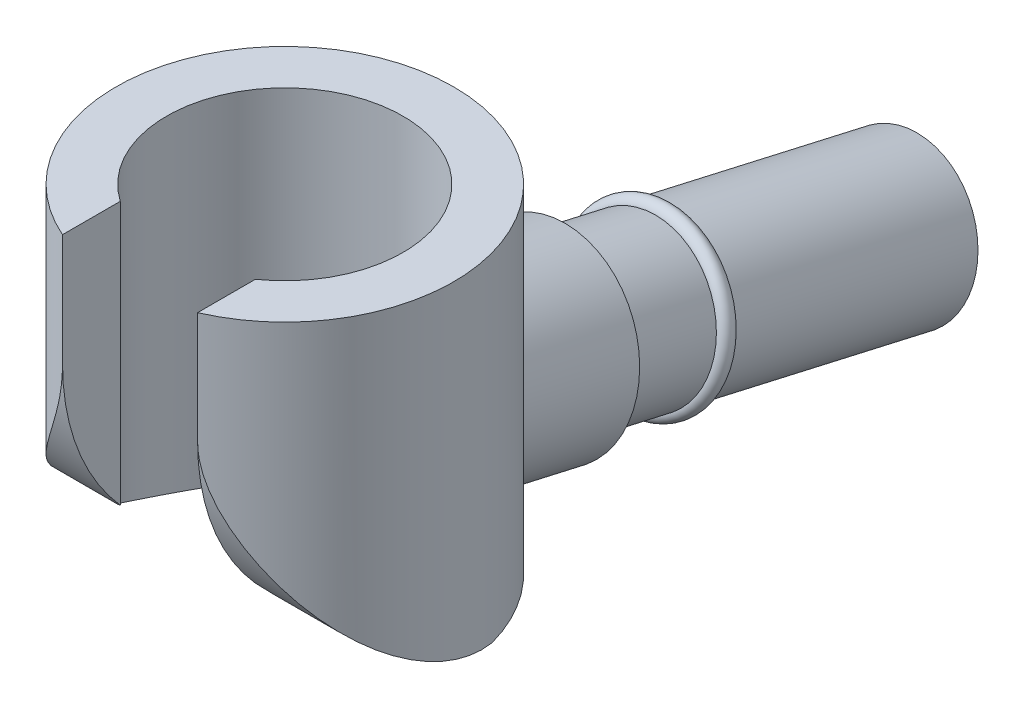
ISO-10303-21;
HEADER;
FILE_DESCRIPTION(('STEP AP214'),'2;1');
FILE_NAME('part.step','',(''),(''),'','','');
FILE_SCHEMA(('AUTOMOTIVE_DESIGN { 1 0 10303 214 1 1 1 1 }'));
ENDSEC;
DATA;
#1=APPLICATION_CONTEXT('core data for automotive mechanical design processes');
#2=APPLICATION_PROTOCOL_DEFINITION('international standard','automotive_design',2000,#1);
#3=PRODUCT_CONTEXT('',#1,'mechanical');
#4=PRODUCT('Part','Part','',(#3));
#5=PRODUCT_RELATED_PRODUCT_CATEGORY('part','',(#4));
#6=PRODUCT_DEFINITION_FORMATION('','',#4);
#7=PRODUCT_DEFINITION_CONTEXT('part definition',#1,'design');
#8=PRODUCT_DEFINITION('design','',#6,#7);
#9=PRODUCT_DEFINITION_SHAPE('','',#8);
#10=(LENGTH_UNIT() NAMED_UNIT(*) SI_UNIT(.MILLI.,.METRE.));
#11=(NAMED_UNIT(*) PLANE_ANGLE_UNIT() SI_UNIT($,.RADIAN.));
#12=(NAMED_UNIT(*) SI_UNIT($,.STERADIAN.) SOLID_ANGLE_UNIT());
#13=UNCERTAINTY_MEASURE_WITH_UNIT(LENGTH_MEASURE(1.E-05),#10,'distance_accuracy_value','');
#14=(GEOMETRIC_REPRESENTATION_CONTEXT(3) GLOBAL_UNCERTAINTY_ASSIGNED_CONTEXT((#13)) GLOBAL_UNIT_ASSIGNED_CONTEXT((#10,
#11,#12)) REPRESENTATION_CONTEXT('',''));
#15=CARTESIAN_POINT('',(0.,0.,0.));
#16=DIRECTION('',(0.,0.,1.));
#17=DIRECTION('',(1.,0.,0.));
#18=AXIS2_PLACEMENT_3D('',#15,#16,#17);
#19=CARTESIAN_POINT('',(0.,0.106688074089508,2.83802027552139));
#20=DIRECTION('',(0.,-0.2222292262514,-0.974994446650699));
#21=DIRECTION('',(0.,0.9749944466507,-0.2222292262514));
#22=AXIS2_PLACEMENT_3D('',#19,#20,#21);
#23=CYLINDRICAL_SURFACE('',#22,1.125);
#24=CARTESIAN_POINT('',(0.,-1.733868222328,-5.2371199660459));
#25=DIRECTION('',(0.,-0.2222292262514,-0.9749944466507));
#26=DIRECTION('',(0.,0.9749944466507,-0.2222292262514));
#27=AXIS2_PLACEMENT_3D('',#24,#25,#26);
#28=CIRCLE('',#27,1.125);
#29=CARTESIAN_POINT('',(0.,-0.63699946984596,-5.48712784557873));
#30=VERTEX_POINT('',#29);
#31=EDGE_CURVE('E11',#30,#30,#28,.T.);
#32=CARTESIAN_POINT('',(0.,-1.41657094977734,-3.84502998808623));
#33=DIRECTION('',(0.,-0.2222292262514,-0.9749944466507));
#34=DIRECTION('',(0.,0.9749944466507,-0.2222292262514));
#35=AXIS2_PLACEMENT_3D('',#32,#33,#34);
#36=CIRCLE('',#35,1.125);
#37=CARTESIAN_POINT('',(0.,-0.319702197295298,-4.09503786761905));
#38=VERTEX_POINT('',#37);
#39=EDGE_CURVE('E141',#38,#38,#36,.F.);
#40=CARTESIAN_POINT('',(0.,-0.63699946984596,-5.48712784557873));
#41=CARTESIAN_POINT('',(0.,-0.633694289923557,-5.47262690830832));
#42=CARTESIAN_POINT('',(0.,-0.630389110001154,-5.45812597103791));
#43=CARTESIAN_POINT('',(0.,-0.623778750156349,-5.42912409649708));
#44=CARTESIAN_POINT('',(0.,-0.620473570233946,-5.41462315922666));
#45=CARTESIAN_POINT('',(0.,-0.613863210389141,-5.38562128468584));
#46=CARTESIAN_POINT('',(0.,-0.610558030466738,-5.37112034741542));
#47=CARTESIAN_POINT('',(0.,-0.603947670621933,-5.3421184728746));
#48=CARTESIAN_POINT('',(0.,-0.60064249069953,-5.32761753560419));
#49=CARTESIAN_POINT('',(0.,-0.594032130854725,-5.29861566106336));
#50=CARTESIAN_POINT('',(0.,-0.590726950932322,-5.28411472379295));
#51=CARTESIAN_POINT('',(0.,-0.584116591087516,-5.25511284925212));
#52=CARTESIAN_POINT('',(0.,-0.580811411165114,-5.24061191198171));
#53=CARTESIAN_POINT('',(0.,-0.574201051320308,-5.21161003744088));
#54=CARTESIAN_POINT('',(0.,-0.570895871397905,-5.19710910017047));
#55=CARTESIAN_POINT('',(0.,-0.5642855115531,-5.16810722562964));
#56=CARTESIAN_POINT('',(0.,-0.560980331630697,-5.15360628835923));
#57=CARTESIAN_POINT('',(0.,-0.554369971785892,-5.1246044138184));
#58=CARTESIAN_POINT('',(0.,-0.551064791863489,-5.11010347654798));
#59=CARTESIAN_POINT('',(0.,-0.544454432018683,-5.08110160200716));
#60=CARTESIAN_POINT('',(0.,-0.541149252096281,-5.06660066473674));
#61=CARTESIAN_POINT('',(0.,-0.534538892251475,-5.03759879019592));
#62=CARTESIAN_POINT('',(0.,-0.531233712329073,-5.02309785292551));
#63=CARTESIAN_POINT('',(0.,-0.524623352484267,-4.99409597838468));
#64=CARTESIAN_POINT('',(0.,-0.521318172561864,-4.97959504111427));
#65=CARTESIAN_POINT('',(0.,-0.514707812717059,-4.95059316657344));
#66=CARTESIAN_POINT('',(0.,-0.511402632794656,-4.93609222930302));
#67=CARTESIAN_POINT('',(0.,-0.504792272949851,-4.9070903547622));
#68=CARTESIAN_POINT('',(0.,-0.501487093027448,-4.89258941749178));
#69=CARTESIAN_POINT('',(0.,-0.494876733182643,-4.86358754295096));
#70=CARTESIAN_POINT('',(0.,-0.49157155326024,-4.84908660568054));
#71=CARTESIAN_POINT('',(0.,-0.484961193415434,-4.82008473113972));
#72=CARTESIAN_POINT('',(0.,-0.481656013493032,-4.8055837938693));
#73=CARTESIAN_POINT('',(0.,-0.475045653648226,-4.77658191932848));
#74=CARTESIAN_POINT('',(0.,-0.471740473725823,-4.76208098205807));
#75=CARTESIAN_POINT('',(0.,-0.465130113881018,-4.73307910751724));
#76=CARTESIAN_POINT('',(0.,-0.461824933958615,-4.71857817024683));
#77=CARTESIAN_POINT('',(0.,-0.45521457411381,-4.689576295706));
#78=CARTESIAN_POINT('',(0.,-0.451909394191407,-4.67507535843558));
#79=CARTESIAN_POINT('',(0.,-0.445299034346602,-4.64607348389476));
#80=CARTESIAN_POINT('',(0.,-0.441993854424199,-4.63157254662435));
#81=CARTESIAN_POINT('',(0.,-0.435383494579394,-4.60257067208352));
#82=CARTESIAN_POINT('',(0.,-0.432078314656991,-4.58806973481311));
#83=CARTESIAN_POINT('',(0.,-0.425467954812185,-4.55906786027228));
#84=CARTESIAN_POINT('',(0.,-0.422162774889783,-4.54456692300186));
#85=CARTESIAN_POINT('',(0.,-0.415552415044977,-4.51556504846104));
#86=CARTESIAN_POINT('',(0.,-0.412247235122574,-4.50106411119063));
#87=CARTESIAN_POINT('',(0.,-0.405636875277769,-4.4720622366498));
#88=CARTESIAN_POINT('',(0.,-0.402331695355366,-4.45756129937939));
#89=CARTESIAN_POINT('',(0.,-0.395721335510561,-4.42855942483856));
#90=CARTESIAN_POINT('',(0.,-0.392416155588158,-4.41405848756814));
#91=CARTESIAN_POINT('',(0.,-0.385805795743353,-4.38505661302732));
#92=CARTESIAN_POINT('',(0.,-0.38250061582095,-4.37055567575691));
#93=CARTESIAN_POINT('',(0.,-0.375890255976144,-4.34155380121608));
#94=CARTESIAN_POINT('',(0.,-0.372585076053742,-4.32705286394567));
#95=CARTESIAN_POINT('',(0.,-0.365974716208936,-4.29805098940484));
#96=CARTESIAN_POINT('',(0.,-0.362669536286533,-4.28355005213442));
#97=CARTESIAN_POINT('',(0.,-0.356059176441728,-4.2545481775936));
#98=CARTESIAN_POINT('',(0.,-0.352753996519325,-4.24004724032319));
#99=CARTESIAN_POINT('',(0.,-0.34614363667452,-4.21104536578236));
#100=CARTESIAN_POINT('',(0.,-0.342838456752117,-4.19654442851195));
#101=CARTESIAN_POINT('',(0.,-0.336228096907312,-4.16754255397112));
#102=CARTESIAN_POINT('',(0.,-0.332922916984909,-4.1530416167007));
#103=CARTESIAN_POINT('',(0.,-0.326312557140104,-4.12403974215988));
#104=CARTESIAN_POINT('',(0.,-0.323007377217701,-4.10953880488946));
#105=CARTESIAN_POINT('',(0.,-0.319702197295298,-4.09503786761905));
#106=B_SPLINE_CURVE_WITH_KNOTS('',3,(#40,#41,#42,#43,#44,#45,#46,#47,#48,#49,#50,#51,#52,#53,
#54,#55,#56,#57,#58,#59,#60,#61,#62,#63,#64,#65,#66,#67,#68,#69,#70,#71,#72,#73,#74,#75,#76,#77,
#78,#79,#80,#81,#82,#83,#84,#85,#86,#87,#88,#89,#90,#91,#92,#93,#94,#95,#96,#97,#98,#99,#100,
#101,#102,#103,#104,#105),.UNSPECIFIED.,.F.,.F.,(4,2,2,2,2,2,2,2,2,2,2,2,2,2,2,2,2,2,2,2,2,2,2,
2,2,2,2,2,2,2,2,2,4),(0.,0.0446185226599817,0.0892370453199633,0.133855567979943,
0.178474090639925,0.223092613299905,0.267711135959887,0.312329658619867,0.356948181279848,
0.401566703939832,0.446185226599812,0.490803749259792,0.535422271919774,0.580040794579755,
0.624659317239737,0.669277839899717,0.713896362559698,0.758514885219678,0.80313340787966,
0.847751930539642,0.892370453199622,0.936988975859604,0.981607498519585,1.02622602117956,
1.07084454383955,1.11546306649953,1.16008158915951,1.20470011181949,1.24931863447947,
1.29393715713945,1.33855567979943,1.38317420245941,1.42779272511939),.UNSPECIFIED.);
#107=EDGE_CURVE('BSEAM39',#30,#38,#106,.T.);
#108=ORIENTED_EDGE('',*,*,#31,.F.);
#109=ORIENTED_EDGE('',*,*,#39,.F.);
#110=ORIENTED_EDGE('',*,*,#107,.T.);
#111=ORIENTED_EDGE('',*,*,#107,.F.);
#112=EDGE_LOOP('',(#108,#110,#109,#111));
#113=FACE_BOUND('',#112,.T.);
#114=ADVANCED_FACE('F39',(#113),#23,.T.);
#115=CARTESIAN_POINT('',(0.,2.5,0.));
#116=DIRECTION('',(0.,-1.,0.));
#117=DIRECTION('',(0.,0.,-1.));
#118=AXIS2_PLACEMENT_3D('',#115,#116,#117);
#119=CYLINDRICAL_SURFACE('',#118,2.5);
#120=CARTESIAN_POINT('',(0.,-2.5,0.));
#121=DIRECTION('',(0.,1.,0.));
#122=DIRECTION('',(0.,0.,1.));
#123=AXIS2_PLACEMENT_3D('',#120,#121,#122);
#124=CIRCLE('',#123,2.5);
#125=CARTESIAN_POINT('',(2.41130669969625,-2.5,-0.66));
#126=VERTEX_POINT('',#125);
#127=CARTESIAN_POINT('',(0.219384184354615,-2.5,-2.49035551270397));
#128=VERTEX_POINT('',#127);
#129=EDGE_CURVE('E108',#126,#128,#124,.T.);
#130=ORIENTED_EDGE('',*,*,#129,.T.);
#131=CARTESIAN_POINT('',(-0.219384184354619,-2.5,-2.49035551270397));
#132=CARTESIAN_POINT('',(-0.255186779967023,-2.49335082409158,-2.48720587012431));
#133=CARTESIAN_POINT('',(-0.290593340782335,-2.48509730880903,-2.48330394028805));
#134=CARTESIAN_POINT('',(-0.360341473433882,-2.46557857394026,-2.47414337462914));
#135=CARTESIAN_POINT('',(-0.394684286777849,-2.45431702518333,-2.46888639270506));
#136=CARTESIAN_POINT('',(-0.495251624868432,-2.41650517327502,-2.45139168234314));
#137=CARTESIAN_POINT('',(-0.559644725889556,-2.38580525646917,-2.43737033231907));
#138=CARTESIAN_POINT('',(-0.681796382824822,-2.31528005993979,-2.40606067272275));
#139=CARTESIAN_POINT('',(-0.739583764428192,-2.27549689203829,-2.38878750216002));
#140=CARTESIAN_POINT('',(-0.848467261338633,-2.18820110245933,-2.35231932653994));
#141=CARTESIAN_POINT('',(-0.899548415823743,-2.14067171166859,-2.33312018758849));
#142=CARTESIAN_POINT('',(-1.0018655679547,-2.03142565402125,-2.29123776749753));
#143=CARTESIAN_POINT('',(-1.05193606687366,-1.96865080639628,-2.26846983248171));
#144=CARTESIAN_POINT('',(-1.14231367060557,-1.83589673530843,-2.22433197663305));
#145=CARTESIAN_POINT('',(-1.18260906117861,-1.76590900976155,-2.20296375533724));
#146=CARTESIAN_POINT('',(-1.25763113103794,-1.60967489732566,-2.16112363599803));
#147=CARTESIAN_POINT('',(-1.29080024084887,-1.52252174278132,-2.1411912093188));
#148=CARTESIAN_POINT('',(-1.34169056980941,-1.34242329934212,-2.10969010799472));
#149=CARTESIAN_POINT('',(-1.35945312685521,-1.24949423140366,-2.0980990666072));
#150=CARTESIAN_POINT('',(-1.37468077974765,-1.08878704344612,-2.08813223944079));
#151=CARTESIAN_POINT('',(-1.37656182934873,-1.02159893815454,-2.08688355811567));
#152=CARTESIAN_POINT('',(-1.37081683820408,-0.887818342050301,-2.0906648193489));
#153=CARTESIAN_POINT('',(-1.36319901149814,-0.821225386715896,-2.09568933723798));
#154=CARTESIAN_POINT('',(-1.33827128545406,-0.690570301174489,-2.11169206036338));
#155=CARTESIAN_POINT('',(-1.32095355466029,-0.62651026077709,-2.12267507611381));
#156=CARTESIAN_POINT('',(-1.27700145725164,-0.50271105292956,-2.14940050226911));
#157=CARTESIAN_POINT('',(-1.25036087291475,-0.442974801326035,-2.16514608803758));
#158=CARTESIAN_POINT('',(-1.18838052366894,-0.328837013507613,-2.19977548904115));
#159=CARTESIAN_POINT('',(-1.15299931903326,-0.274462668490319,-2.21867411022504));
#160=CARTESIAN_POINT('',(-1.07449715410684,-0.17214906551925,-2.25773733912602));
#161=CARTESIAN_POINT('',(-1.03137362881243,-0.124211949424583,-2.27790236495462));
#162=CARTESIAN_POINT('',(-0.932885520441992,-0.0301609932756652,-2.32011014052549));
#163=CARTESIAN_POINT('',(-0.876681951949325,0.0151003685279647,-2.34210024384101));
#164=CARTESIAN_POINT('',(-0.75702779891279,0.096308593153384,-2.38346770627311));
#165=CARTESIAN_POINT('',(-0.693574884105899,0.132252448707723,-2.40284422087659));
#166=CARTESIAN_POINT('',(-0.557611797058086,0.195698288283308,-2.43807949489064));
#167=CARTESIAN_POINT('',(-0.484810532133151,0.222701842156806,-2.45372005063469));
#168=CARTESIAN_POINT('',(-0.334858345337995,0.265042531319288,-2.47863668177924));
#169=CARTESIAN_POINT('',(-0.257708852471134,0.28038347567527,-2.48791483507533));
#170=CARTESIAN_POINT('',(-0.104689543186053,0.298546233658708,-2.49893565426909));
#171=CARTESIAN_POINT('',(-0.0288996022025996,0.301861414455222,-2.50097521049408));
#172=CARTESIAN_POINT('',(0.12219903194427,0.297242149113583,-2.49815423542061));
#173=CARTESIAN_POINT('',(0.19750779079063,0.28930927281489,-2.49329466700102));
#174=CARTESIAN_POINT('',(0.34331262321269,0.262825450921442,-2.47737101996201));
#175=CARTESIAN_POINT('',(0.413884542247856,0.244580563196393,-2.4664859602746));
#176=CARTESIAN_POINT('',(0.550649970771421,0.198174280383473,-2.43959936047269));
#177=CARTESIAN_POINT('',(0.616842798565698,0.170011345645602,-2.42359702600218));
#178=CARTESIAN_POINT('',(0.745502416206489,0.10320629108337,-2.38722626497336));
#179=CARTESIAN_POINT('',(0.807760770529722,0.0642350285872427,-2.3667258226328));
#180=CARTESIAN_POINT('',(0.924538479065501,-0.0230749586336776,-2.32359818714786));
#181=CARTESIAN_POINT('',(0.979053330345681,-0.0714190954623333,-2.30096976916972));
#182=CARTESIAN_POINT('',(1.08095506098864,-0.178860852036004,-2.25494616362363));
#183=CARTESIAN_POINT('',(1.12798239179036,-0.238303490891133,-2.23155537087311));
#184=CARTESIAN_POINT('',(1.21073953079727,-0.365560956016161,-2.18776355321668));
#185=CARTESIAN_POINT('',(1.24647940207987,-0.433368249529057,-2.16735987397478));
#186=CARTESIAN_POINT('',(1.30341865003856,-0.57105393374215,-2.13357298195076));
#187=CARTESIAN_POINT('',(1.32541342012666,-0.640509826830616,-2.119819087244));
#188=CARTESIAN_POINT('',(1.35766439855938,-0.783056618390243,-2.09931511312568));
#189=CARTESIAN_POINT('',(1.36792978987959,-0.856144626416932,-2.09255955507695));
#190=CARTESIAN_POINT('',(1.37639728814623,-0.995620536483015,-2.08699437244454));
#191=CARTESIAN_POINT('',(1.3757409210038,-1.06191646057549,-2.08743277312391));
#192=CARTESIAN_POINT('',(1.36572438160862,-1.193550716348,-2.09399856039796));
#193=CARTESIAN_POINT('',(1.35636014013997,-1.25888858582549,-2.10012860671374));
#194=CARTESIAN_POINT('',(1.32881163976986,-1.39165885530708,-2.11767333009885));
#195=CARTESIAN_POINT('',(1.31006736584632,-1.45892834621216,-2.1294211128065));
#196=CARTESIAN_POINT('',(1.26444796618016,-1.58980529722393,-2.15682092448084));
#197=CARTESIAN_POINT('',(1.2375675980313,-1.65341036465052,-2.17247546958384));
#198=CARTESIAN_POINT('',(1.1698939780881,-1.78909245800422,-2.2097822172468));
#199=CARTESIAN_POINT('',(1.12736542374706,-1.8601503839319,-2.23200377484648));
#200=CARTESIAN_POINT('',(1.03198146752889,-1.99462145531971,-2.27767703483122));
#201=CARTESIAN_POINT('',(0.979117259982512,-2.05802800701542,-2.30112977359472));
#202=CARTESIAN_POINT('',(0.867547879087804,-2.1713915143626,-2.34535783359966));
#203=CARTESIAN_POINT('',(0.809518109714631,-2.22198181402977,-2.36620530563946));
#204=CARTESIAN_POINT('',(0.685457666371332,-2.31322961917076,-2.40506785185585));
#205=CARTESIAN_POINT('',(0.619454177200612,-2.35391952348893,-2.42309209407596));
#206=CARTESIAN_POINT('',(0.498315367584082,-2.41435184271782,-2.45040135077659));
#207=CARTESIAN_POINT('',(0.444765490431419,-2.43679023430068,-2.4607414172907));
#208=CARTESIAN_POINT('',(0.334319998814359,-2.47426257352081,-2.478188261799));
#209=CARTESIAN_POINT('',(0.277407752101724,-2.48925553218171,-2.4852771251203));
#210=CARTESIAN_POINT('',(0.219384184354619,-2.5,-2.49035551270397));
#211=B_SPLINE_CURVE_WITH_KNOTS('',3,(#131,#132,#133,#134,#135,#136,#137,#138,#139,#140,#141,
#142,#143,#144,#145,#146,#147,#148,#149,#150,#151,#152,#153,#154,#155,#156,#157,#158,#159,#160,
#161,#162,#163,#164,#165,#166,#167,#168,#169,#170,#171,#172,#173,#174,#175,#176,#177,#178,#179,
#180,#181,#182,#183,#184,#185,#186,#187,#188,#189,#190,#191,#192,#193,#194,#195,#196,#197,#198,
#199,#200,#201,#202,#203,#204,#205,#206,#207,#208,#209,#210),.UNSPECIFIED.,.F.,.F.,(4,2,2,2,2,2,
2,2,2,2,2,2,2,2,2,2,2,2,2,2,2,2,2,2,2,2,2,2,2,2,2,2,2,2,2,2,2,2,2,4),(0.,0.109553740909273,
0.218974394819068,0.43591274284376,0.651865039673394,0.868291198539255,1.11773856533307,
1.36748340289171,1.65201675190361,1.93578427602946,2.1365886288204,2.33721945880444,
2.53801250699046,2.73893972677989,2.94083847660591,3.14280423862265,3.36813455393789,
3.5935375053392,3.82995650241975,4.06629825065297,4.29282668439989,4.51932350572969,
4.73942657143294,4.9595638203957,5.18732500364367,5.41521809501664,5.65197177800612,
5.88851378888475,6.10965037943904,6.33061372242751,6.52864194169932,6.72676274668293,
6.93844912793856,7.15027219849173,7.40649937500913,7.66294580827424,7.90129603782285,
8.13885545140849,8.31516579401583,8.49243629684628),.UNSPECIFIED.);
#212=CARTESIAN_POINT('',(-0.219384184354619,-2.5,-2.49035551270397));
#213=VERTEX_POINT('',#212);
#214=EDGE_CURVE('E54',#213,#128,#211,.T.);
#215=ORIENTED_EDGE('',*,*,#214,.F.);
#216=CARTESIAN_POINT('',(-2.41130669969625,-2.5,-0.659999999999999));
#217=VERTEX_POINT('',#216);
#218=EDGE_CURVE('E105',#213,#217,#124,.T.);
#219=ORIENTED_EDGE('',*,*,#218,.T.);
#220=CARTESIAN_POINT('',(-1.,0.850000000000001,2.29128784747792));
#221=CARTESIAN_POINT('',(-0.999937958422172,0.801579105627371,2.29129949679798));
#222=CARTESIAN_POINT('',(-1.00238564768928,0.753204064898996,2.29024701082834));
#223=CARTESIAN_POINT('',(-1.01179284561074,0.657139607972769,2.28611452157189));
#224=CARTESIAN_POINT('',(-1.0187371175404,0.609448430285604,2.28304136481144));
#225=CARTESIAN_POINT('',(-1.03647734558849,0.515850884944401,2.27503868955448));
#226=CARTESIAN_POINT('',(-1.04720279831901,0.469927863783527,2.27014306483114));
#227=CARTESIAN_POINT('',(-1.0718461604706,0.379140610572085,2.25861300207627));
#228=CARTESIAN_POINT('',(-1.08576709279168,0.334277425724883,2.25197691672895));
#229=CARTESIAN_POINT('',(-1.12619540778974,0.216333554157594,2.23214417074754));
#230=CARTESIAN_POINT('',(-1.1549293231031,0.144260195624347,2.21751451297561));
#231=CARTESIAN_POINT('',(-1.21683589721039,0.00304787535303509,2.18415900336597));
#232=CARTESIAN_POINT('',(-1.25001157779933,-0.0660890461320796,2.16543035737496));
#233=CARTESIAN_POINT('',(-1.3194336646557,-0.202589313934496,2.12385296017166));
#234=CARTESIAN_POINT('',(-1.35571112160872,-0.269922938489367,2.10095910495329));
#235=CARTESIAN_POINT('',(-1.4297497148386,-0.402312444698018,2.05129425258822));
#236=CARTESIAN_POINT('',(-1.46751129349936,-0.467367636104561,2.0245220929189));
#237=CARTESIAN_POINT('',(-1.56188743066732,-0.62618987874318,1.9533241159604));
#238=CARTESIAN_POINT('',(-1.61884498497211,-0.718737948005976,1.90659570226283));
#239=CARTESIAN_POINT('',(-1.73183983801144,-0.899569072955493,1.80459160651131));
#240=CARTESIAN_POINT('',(-1.78787669643432,-0.987850125054751,1.74931195940726));
#241=CARTESIAN_POINT('',(-1.95150142488342,-1.24527646447137,1.57083919190796));
#242=CARTESIAN_POINT('',(-2.05536520365707,-1.40820946738173,1.43447805536141));
#243=CARTESIAN_POINT('',(-2.20708105709798,-1.65801777077192,1.18000280028187));
#244=CARTESIAN_POINT('',(-2.26178046913896,-1.75147813406713,1.07235980739644));
#245=CARTESIAN_POINT('',(-2.35722070775176,-1.92644409550327,0.842014301287578));
#246=CARTESIAN_POINT('',(-2.39797357764628,-2.00795997315565,0.719324906168244));
#247=CARTESIAN_POINT('',(-2.45551883326305,-2.14338051938298,0.482385793319588));
#248=CARTESIAN_POINT('',(-2.47518641613746,-2.19962316791889,0.370181138362285));
#249=CARTESIAN_POINT('',(-2.49883495345913,-2.29961722947135,0.138848919028895));
#250=CARTESIAN_POINT('',(-2.5028441007665,-2.34339096073747,0.0197341891228062));
#251=CARTESIAN_POINT('',(-2.4942204544191,-2.40835738351625,-0.193395907923674));
#252=CARTESIAN_POINT('',(-2.48529897969413,-2.43244209462352,-0.286685469230009));
#253=CARTESIAN_POINT('',(-2.46375604918711,-2.46238432268127,-0.426795877749868));
#254=CARTESIAN_POINT('',(-2.45519155977459,-2.47134504667182,-0.473615262989384));
#255=CARTESIAN_POINT('',(-2.4353142768711,-2.4872094855879,-0.567034853020757));
#256=CARTESIAN_POINT('',(-2.42400058715895,-2.49411252808548,-0.613634981276185));
#257=CARTESIAN_POINT('',(-2.41130669969625,-2.5,-0.659999999999999));
#258=B_SPLINE_CURVE_WITH_KNOTS('',3,(#220,#221,#222,#223,#224,#225,#226,#227,#228,#229,#230,
#231,#232,#233,#234,#235,#236,#237,#238,#239,#240,#241,#242,#243,#244,#245,#246,#247,#248,#249,
#250,#251,#252,#253,#254,#255,#256,#257),.UNSPECIFIED.,.F.,.F.,(4,2,2,2,2,2,2,2,2,2,2,2,2,2,2,2,
2,2,4),(0.,0.145116292225023,0.289743411308483,0.431805230146365,0.574001996330817,
0.810452780245971,1.04706525015712,1.28641157194819,1.52582978687737,1.88025354206948,
2.23484213240563,2.93950310543953,3.39613804670064,3.85237766693996,4.23196703975236,
4.61087264968618,4.90017375043309,5.04536120114352,5.1905960456507),.UNSPECIFIED.);
#259=CARTESIAN_POINT('',(-1.,0.85,2.29128784747792));
#260=VERTEX_POINT('',#259);
#261=EDGE_CURVE('E115',#260,#217,#258,.T.);
#262=ORIENTED_EDGE('',*,*,#261,.F.);
#263=DIRECTION('',(0.,-1.,0.));
#264=VECTOR('',#263,1.);
#265=CARTESIAN_POINT('',(-1.,2.5,2.29128784747792));
#266=LINE('',#265,#264);
#267=CARTESIAN_POINT('',(-1.,2.5,2.29128784747792));
#268=VERTEX_POINT('',#267);
#269=EDGE_CURVE('E136',#268,#260,#266,.T.);
#270=ORIENTED_EDGE('',*,*,#269,.F.);
#271=CARTESIAN_POINT('',(0.,2.5,0.));
#272=DIRECTION('',(0.,1.,0.));
#273=DIRECTION('',(0.,0.,1.));
#274=AXIS2_PLACEMENT_3D('',#271,#272,#273);
#275=CIRCLE('',#274,2.5);
#276=CARTESIAN_POINT('',(1.,2.5,2.29128784747792));
#277=VERTEX_POINT('',#276);
#278=EDGE_CURVE('E126',#277,#268,#275,.T.);
#279=ORIENTED_EDGE('',*,*,#278,.F.);
#280=DIRECTION('',(0.,-1.,0.));
#281=VECTOR('',#280,1.);
#282=CARTESIAN_POINT('',(1.,2.5,2.29128784747792));
#283=LINE('',#282,#281);
#284=CARTESIAN_POINT('',(1.,0.85,2.29128784747792));
#285=VERTEX_POINT('',#284);
#286=EDGE_CURVE('E127',#277,#285,#283,.T.);
#287=ORIENTED_EDGE('',*,*,#286,.T.);
#288=CARTESIAN_POINT('',(2.41130669969625,-2.5,-0.659999999999999));
#289=CARTESIAN_POINT('',(2.42745970540553,-2.4925224177079,-0.601036339123867));
#290=CARTESIAN_POINT('',(2.441368866193,-2.48338447408475,-0.541675374482108));
#291=CARTESIAN_POINT('',(2.4647442585609,-2.46177127766212,-0.422717712996618));
#292=CARTESIAN_POINT('',(2.47421269977685,-2.4492976894914,-0.363121148302988));
#293=CARTESIAN_POINT('',(2.48871547141529,-2.42109021814085,-0.24461571848185));
#294=CARTESIAN_POINT('',(2.49378096224948,-2.40538023621529,-0.185704980764622));
#295=CARTESIAN_POINT('',(2.49974565320429,-2.37073141100746,-0.0686411257621628));
#296=CARTESIAN_POINT('',(2.50064457780181,-2.35179235428157,-0.0104880588330834));
#297=CARTESIAN_POINT('',(2.4973853883414,-2.29037250667678,0.161974020371972));
#298=CARTESIAN_POINT('',(2.48730520786167,-2.24321856387991,0.274582117887437));
#299=CARTESIAN_POINT('',(2.45351283028644,-2.13798533546282,0.49243634090751));
#300=CARTESIAN_POINT('',(2.42977663503142,-2.07988693799692,0.597669139393228));
#301=CARTESIAN_POINT('',(2.36015876536052,-1.93100322917406,0.836923223331761));
#302=CARTESIAN_POINT('',(2.30931151928592,-1.83612771098483,0.966954278962182));
#303=CARTESIAN_POINT('',(2.1925982247573,-1.6330210358564,1.20854770454745));
#304=CARTESIAN_POINT('',(2.12670454301742,-1.52476547594452,1.32007543361938));
#305=CARTESIAN_POINT('',(2.00751116187544,-1.3336865797561,1.49236169156739));
#306=CARTESIAN_POINT('',(1.95678552582207,-1.25359799143753,1.55804424624378));
#307=CARTESIAN_POINT('',(1.85224814406491,-1.08907760157743,1.68097759746323));
#308=CARTESIAN_POINT('',(1.79843625291599,-1.00464559536416,1.73822799617193));
#309=CARTESIAN_POINT('',(1.68911878946203,-0.831501962726443,1.8446423383809));
#310=CARTESIAN_POINT('',(1.63360917951518,-0.742779785919259,1.89378488289768));
#311=CARTESIAN_POINT('',(1.52284966317443,-0.561233016886666,1.98394223155908));
#312=CARTESIAN_POINT('',(1.46759963614271,-0.468410594416377,2.02496127292324));
#313=CARTESIAN_POINT('',(1.35522805445461,-0.270241495095874,2.1019827326037));
#314=CARTESIAN_POINT('',(1.29832634656818,-0.164492651627803,2.13729502094468));
#315=CARTESIAN_POINT('',(1.21930278425905,-0.00126908531485326,2.18271141167134));
#316=CARTESIAN_POINT('',(1.19410608680725,0.0536732273566707,2.19655043444126));
#317=CARTESIAN_POINT('',(1.14670535341879,0.1653952183894,2.22166207762166));
#318=CARTESIAN_POINT('',(1.12450114247075,0.222174789060095,2.2329348481424));
#319=CARTESIAN_POINT('',(1.07309749605041,0.370029276358621,2.25824733811499));
#320=CARTESIAN_POINT('',(1.04688856340569,0.462594145854952,2.27033198138852));
#321=CARTESIAN_POINT('',(1.01941674037457,0.60508367244109,2.28273981741603));
#322=CARTESIAN_POINT('',(1.01222390992232,0.65362351182498,2.28592449222381));
#323=CARTESIAN_POINT('',(1.00247620164124,0.751419807714375,2.29020742500528));
#324=CARTESIAN_POINT('',(0.999937457933389,0.800678162672043,2.29129842553838));
#325=CARTESIAN_POINT('',(1.,0.850000000000001,2.29128784747792));
#326=B_SPLINE_CURVE_WITH_KNOTS('',3,(#288,#289,#290,#291,#292,#293,#294,#295,#296,#297,#298,
#299,#300,#301,#302,#303,#304,#305,#306,#307,#308,#309,#310,#311,#312,#313,#314,#315,#316,#317,
#318,#319,#320,#321,#322,#323,#324,#325),.UNSPECIFIED.,.F.,.F.,(4,2,2,2,2,2,2,2,2,2,2,2,2,2,2,2,
2,2,4),(0.,0.184701795140571,0.36931158767331,0.552603972358907,0.735908477472147,
1.10161047413609,1.46795710242605,1.97159269728005,2.47616078295594,2.82173990689945,
3.16733533026123,3.51382877357596,3.86014100711613,4.23493790320113,4.42083286607194,
4.60671695241457,4.89611760632491,5.0433893795094,5.19117073487081),.UNSPECIFIED.);
#327=EDGE_CURVE('E167',#126,#285,#326,.T.);
#328=ORIENTED_EDGE('',*,*,#327,.F.);
#329=EDGE_LOOP('',(#130,#215,#219,#262,#270,#279,#287,#328));
#330=FACE_BOUND('',#329,.T.);
#331=ADVANCED_FACE('F41',(#330),#119,.T.);
#332=CARTESIAN_POINT('',(-1.,2.5,1.43614066163451));
#333=DIRECTION('',(-1.,0.,0.));
#334=DIRECTION('',(0.,0.,1.));
#335=AXIS2_PLACEMENT_3D('',#332,#333,#334);
#336=PLANE('',#335);
#337=CARTESIAN_POINT('',(-0.999999999999999,0.85,-1.08564469668321));
#338=DIRECTION('',(-1.,0.,0.));
#339=DIRECTION('',(0.,0.,1.));
#340=AXIS2_PLACEMENT_3D('',#337,#338,#339);
#341=CIRCLE('',#340,3.37693254416113);
#342=CARTESIAN_POINT('',(-0.999999999999999,-1.3959456837575,1.43614066163451));
#343=VERTEX_POINT('',#342);
#344=EDGE_CURVE('E118',#343,#260,#341,.T.);
#345=ORIENTED_EDGE('',*,*,#344,.F.);
#346=DIRECTION('',(0.,-1.,0.));
#347=VECTOR('',#346,1.);
#348=CARTESIAN_POINT('',(-1.,2.5,1.43614066163451));
#349=LINE('',#348,#347);
#350=CARTESIAN_POINT('',(-1.,2.5,1.43614066163451));
#351=VERTEX_POINT('',#350);
#352=EDGE_CURVE('E133',#351,#343,#349,.T.);
#353=ORIENTED_EDGE('',*,*,#352,.F.);
#354=DIRECTION('',(0.,0.,-1.));
#355=VECTOR('',#354,1.);
#356=CARTESIAN_POINT('',(-1.,2.5,1.43614066163451));
#357=LINE('',#356,#355);
#358=EDGE_CURVE('E203',#268,#351,#357,.T.);
#359=ORIENTED_EDGE('',*,*,#358,.F.);
#360=ORIENTED_EDGE('',*,*,#269,.T.);
#361=EDGE_LOOP('',(#345,#353,#359,#360));
#362=FACE_BOUND('',#361,.T.);
#363=ADVANCED_FACE('F217',(#362),#336,.F.);
#364=CARTESIAN_POINT('',(0.,2.5,0.));
#365=DIRECTION('',(0.,-1.,0.));
#366=DIRECTION('',(0.,0.,-1.));
#367=AXIS2_PLACEMENT_3D('',#364,#365,#366);
#368=CYLINDRICAL_SURFACE('',#367,1.75);
#369=CARTESIAN_POINT('',(1.,-1.3959456837575,1.43614066163451));
#370=CARTESIAN_POINT('',(1.05119716578695,-1.43604219533001,1.40045075712328));
#371=CARTESIAN_POINT('',(1.10011955554756,-1.4768686444467,1.36235662196239));
#372=CARTESIAN_POINT('',(1.19342653748091,-1.55912820114835,1.28143731362468));
#373=CARTESIAN_POINT('',(1.23780737785426,-1.60056177849728,1.23860828872413));
#374=CARTESIAN_POINT('',(1.32229344762224,-1.68344182577385,1.14799679626975));
#375=CARTESIAN_POINT('',(1.36236188847016,-1.72488578046949,1.10017766221611));
#376=CARTESIAN_POINT('',(1.43751869572505,-1.80669337355353,0.999981550354037));
#377=CARTESIAN_POINT('',(1.47260926077496,-1.84705748245906,0.947606601365005));
#378=CARTESIAN_POINT('',(1.55454772862816,-1.94690348950303,0.809505761418332));
#379=CARTESIAN_POINT('',(1.59783096700588,-2.00523614193588,0.720763065565744));
#380=CARTESIAN_POINT('',(1.66953584029232,-2.11517407443312,0.533953793128779));
#381=CARTESIAN_POINT('',(1.69800823395546,-2.16680187023633,0.435920441148896));
#382=CARTESIAN_POINT('',(1.73448197255975,-2.25370117797326,0.248389441215261));
#383=CARTESIAN_POINT('',(1.74500639483016,-2.29026814428173,0.1599893547169));
#384=CARTESIAN_POINT('',(1.75219767498745,-2.35585147058173,-0.0201189724800908));
#385=CARTESIAN_POINT('',(1.74887609013229,-2.38487410633265,-0.111824390850822));
#386=CARTESIAN_POINT('',(1.72908192065222,-2.43055088921633,-0.280653308882468));
#387=CARTESIAN_POINT('',(1.71485566847637,-2.44845292190732,-0.357701482713209));
#388=CARTESIAN_POINT('',(1.68556489771002,-2.47096884994555,-0.47215848120816));
#389=CARTESIAN_POINT('',(1.67444957393131,-2.47775938047961,-0.510190616901739));
#390=CARTESIAN_POINT('',(1.64958218930333,-2.48992768047891,-0.585625443273201));
#391=CARTESIAN_POINT('',(1.63582939623955,-2.49530505663912,-0.623027956011094));
#392=CARTESIAN_POINT('',(1.62077142126828,-2.5,-0.66));
#393=B_SPLINE_CURVE_WITH_KNOTS('',3,(#369,#370,#371,#372,#373,#374,#375,#376,#377,#378,#379,
#380,#381,#382,#383,#384,#385,#386,#387,#388,#389,#390,#391,#392),.UNSPECIFIED.,.F.,.F.,(4,2,2,
2,2,2,2,2,2,2,2,4),(0.,0.222434961753061,0.445052219503953,0.669438947451613,0.893726256950156,
1.23634723477062,1.57778613725169,1.86529446084157,2.15256284939559,2.39271455952395,
2.51321359269452,2.63374612737449),.UNSPECIFIED.);
#394=CARTESIAN_POINT('',(1.,-1.3959456837575,1.43614066163451));
#395=VERTEX_POINT('',#394);
#396=CARTESIAN_POINT('',(1.62077142126828,-2.5,-0.659999999999999));
#397=VERTEX_POINT('',#396);
#398=EDGE_CURVE('E62',#395,#397,#393,.T.);
#399=ORIENTED_EDGE('',*,*,#398,.F.);
#400=DIRECTION('',(0.,-1.,0.));
#401=VECTOR('',#400,1.);
#402=CARTESIAN_POINT('',(1.,2.5,1.43614066163451));
#403=LINE('',#402,#401);
#404=CARTESIAN_POINT('',(1.,2.5,1.43614066163451));
#405=VERTEX_POINT('',#404);
#406=EDGE_CURVE('E130',#405,#395,#403,.T.);
#407=ORIENTED_EDGE('',*,*,#406,.F.);
#408=CARTESIAN_POINT('',(0.,2.5,0.));
#409=DIRECTION('',(0.,-1.,0.));
#410=DIRECTION('',(0.,0.,1.));
#411=AXIS2_PLACEMENT_3D('',#408,#409,#410);
#412=CIRCLE('',#411,1.75);
#413=EDGE_CURVE('E204',#351,#405,#412,.T.);
#414=ORIENTED_EDGE('',*,*,#413,.F.);
#415=ORIENTED_EDGE('',*,*,#352,.T.);
#416=CARTESIAN_POINT('',(-1.62077142126828,-2.5,-0.659999999999999));
#417=CARTESIAN_POINT('',(-1.63811180264016,-2.49460019063493,-0.6174392488089));
#418=CARTESIAN_POINT('',(-1.65371861283596,-2.48828612833255,-0.574291653535821));
#419=CARTESIAN_POINT('',(-1.68142964787208,-2.47377550094098,-0.487210152568183));
#420=CARTESIAN_POINT('',(-1.69353493318141,-2.4655795071638,-0.443276489230876));
#421=CARTESIAN_POINT('',(-1.71416618498637,-2.4472937622848,-0.355205275513765));
#422=CARTESIAN_POINT('',(-1.72270979048221,-2.43721371060249,-0.31106985129553));
#423=CARTESIAN_POINT('',(-1.7363408603227,-2.41514482280149,-0.222754647411881));
#424=CARTESIAN_POINT('',(-1.74142825354859,-2.40315594741104,-0.178574866852476));
#425=CARTESIAN_POINT('',(-1.75159860861703,-2.36439584297831,-0.046557772030172));
#426=CARTESIAN_POINT('',(-1.7516224194831,-2.33480169636394,0.0409005558822648));
#427=CARTESIAN_POINT('',(-1.73920744529551,-2.26889379701858,0.212292843940355));
#428=CARTESIAN_POINT('',(-1.72675818362563,-2.23257441640848,0.296223779544228));
#429=CARTESIAN_POINT('',(-1.68966332080109,-2.15186237822908,0.464099851971889));
#430=CARTESIAN_POINT('',(-1.66429203676286,-2.10710305603115,0.547706040523792));
#431=CARTESIAN_POINT('',(-1.6027200006115,-2.01276352753175,0.707934185941385));
#432=CARTESIAN_POINT('',(-1.5665090317759,-1.96317880303566,0.784549464380777));
#433=CARTESIAN_POINT('',(-1.47688058657998,-1.85097512235509,0.944044065380787));
#434=CARTESIAN_POINT('',(-1.42149896118854,-1.78767330065109,1.02533350957692));
#435=CARTESIAN_POINT('',(-1.29904300073256,-1.65910594151117,1.17663184492973));
#436=CARTESIAN_POINT('',(-1.23197763618716,-1.59384194217136,1.24664931168182));
#437=CARTESIAN_POINT('',(-1.13415557627759,-1.50670446050908,1.33316215077152));
#438=CARTESIAN_POINT('',(-1.10825974718,-1.48430422192114,1.35477122117843));
#439=CARTESIAN_POINT('',(-1.05514084940018,-1.43984161062914,1.39653717261058));
#440=CARTESIAN_POINT('',(-1.02791992604083,-1.41777876312195,1.41669627807401));
#441=CARTESIAN_POINT('',(-0.999999999999999,-1.3959456837575,1.43614066163451));
#442=B_SPLINE_CURVE_WITH_KNOTS('',3,(#416,#417,#418,#419,#420,#421,#422,#423,#424,#425,#426,
#427,#428,#429,#430,#431,#432,#433,#434,#435,#436,#437,#438,#439,#440,#441),.UNSPECIFIED.,.F.,
.F.,(4,2,2,2,2,2,2,2,2,2,2,2,4),(0.,0.138771745919244,0.27750141942832,0.415535637759922,
0.553572696346743,0.829203023943628,1.10506505836461,1.3984810800905,1.69217453051809,
2.04185232429074,2.39126281687686,2.51269132274097,2.63392938188511),.UNSPECIFIED.);
#443=CARTESIAN_POINT('',(-1.62077142126828,-2.5,-0.66));
#444=VERTEX_POINT('',#443);
#445=EDGE_CURVE('E189',#444,#343,#442,.T.);
#446=ORIENTED_EDGE('',*,*,#445,.F.);
#447=CARTESIAN_POINT('',(0.,-2.5,0.));
#448=DIRECTION('',(0.,-1.,0.));
#449=DIRECTION('',(0.,0.,1.));
#450=AXIS2_PLACEMENT_3D('',#447,#448,#449);
#451=CIRCLE('',#450,1.75);
#452=EDGE_CURVE('E117',#444,#397,#451,.T.);
#453=ORIENTED_EDGE('',*,*,#452,.T.);
#454=EDGE_LOOP('',(#399,#407,#414,#415,#446,#453));
#455=FACE_BOUND('',#454,.T.);
#456=ADVANCED_FACE('F173',(#455),#368,.F.);
#457=CARTESIAN_POINT('',(1.,2.5,1.43614066163451));
#458=DIRECTION('',(1.,0.,0.));
#459=DIRECTION('',(0.,0.,-1.));
#460=AXIS2_PLACEMENT_3D('',#457,#458,#459);
#461=PLANE('',#460);
#462=CARTESIAN_POINT('',(1.,0.85,-1.08564469668321));
#463=DIRECTION('',(1.,0.,0.));
#464=DIRECTION('',(0.,0.,-1.));
#465=AXIS2_PLACEMENT_3D('',#462,#463,#464);
#466=CIRCLE('',#465,3.37693254416113);
#467=EDGE_CURVE('E156',#285,#395,#466,.T.);
#468=ORIENTED_EDGE('',*,*,#467,.F.);
#469=ORIENTED_EDGE('',*,*,#286,.F.);
#470=DIRECTION('',(0.,0.,1.));
#471=VECTOR('',#470,1.);
#472=CARTESIAN_POINT('',(1.,2.5,1.43614066163451));
#473=LINE('',#472,#471);
#474=EDGE_CURVE('E122',#405,#277,#473,.T.);
#475=ORIENTED_EDGE('',*,*,#474,.F.);
#476=ORIENTED_EDGE('',*,*,#406,.T.);
#477=EDGE_LOOP('',(#468,#469,#475,#476));
#478=FACE_BOUND('',#477,.T.);
#479=ADVANCED_FACE('F214',(#478),#461,.F.);
#480=CARTESIAN_POINT('',(0.,-2.5,0.));
#481=DIRECTION('',(0.,1.,0.));
#482=DIRECTION('',(0.,0.,1.));
#483=AXIS2_PLACEMENT_3D('',#480,#481,#482);
#484=PLANE('',#483);
#485=ORIENTED_EDGE('',*,*,#218,.F.);
#486=CARTESIAN_POINT('',(0.,-2.5,-8.59839805368954));
#487=DIRECTION('',(0.,1.,0.));
#488=DIRECTION('',(0.,0.,-1.));
#489=AXIS2_PLACEMENT_3D('',#486,#487,#488);
#490=ELLIPSE('',#489,6.18730498770899,1.375);
#491=EDGE_CURVE('E96',#128,#213,#490,.F.);
#492=ORIENTED_EDGE('',*,*,#491,.F.);
#493=ORIENTED_EDGE('',*,*,#129,.F.);
#494=DIRECTION('',(1.,0.,0.));
#495=VECTOR('',#494,1.);
#496=CARTESIAN_POINT('',(-2.5,-2.5,-0.659999999999999));
#497=LINE('',#496,#495);
#498=EDGE_CURVE('E139',#397,#126,#497,.T.);
#499=ORIENTED_EDGE('',*,*,#498,.F.);
#500=ORIENTED_EDGE('',*,*,#452,.F.);
#501=EDGE_CURVE('E114',#217,#444,#497,.T.);
#502=ORIENTED_EDGE('',*,*,#501,.F.);
#503=EDGE_LOOP('',(#485,#492,#493,#499,#500,#502));
#504=FACE_BOUND('',#503,.T.);
#505=ADVANCED_FACE('F112',(#504),#484,.F.);
#506=CARTESIAN_POINT('',(0.,2.5,0.));
#507=DIRECTION('',(0.,1.,0.));
#508=DIRECTION('',(0.,0.,1.));
#509=AXIS2_PLACEMENT_3D('',#506,#507,#508);
#510=PLANE('',#509);
#511=ORIENTED_EDGE('',*,*,#278,.T.);
#512=ORIENTED_EDGE('',*,*,#358,.T.);
#513=ORIENTED_EDGE('',*,*,#413,.T.);
#514=ORIENTED_EDGE('',*,*,#474,.T.);
#515=EDGE_LOOP('',(#511,#512,#513,#514));
#516=FACE_BOUND('',#515,.T.);
#517=ADVANCED_FACE('F184',(#516),#510,.T.);
#518=CARTESIAN_POINT('',(-2.5,0.85,-1.08564469668321));
#519=DIRECTION('',(1.,0.,0.));
#520=DIRECTION('',(0.,0.,-1.));
#521=AXIS2_PLACEMENT_3D('',#518,#519,#520);
#522=CYLINDRICAL_SURFACE('',#521,3.37693254416113);
#523=ORIENTED_EDGE('',*,*,#327,.T.);
#524=ORIENTED_EDGE('',*,*,#467,.T.);
#525=ORIENTED_EDGE('',*,*,#398,.T.);
#526=ORIENTED_EDGE('',*,*,#498,.T.);
#527=EDGE_LOOP('',(#523,#524,#525,#526));
#528=FACE_BOUND('',#527,.T.);
#529=ADVANCED_FACE('F180',(#528),#522,.T.);
#530=ORIENTED_EDGE('',*,*,#261,.T.);
#531=ORIENTED_EDGE('',*,*,#501,.T.);
#532=ORIENTED_EDGE('',*,*,#445,.T.);
#533=ORIENTED_EDGE('',*,*,#344,.T.);
#534=EDGE_LOOP('',(#530,#531,#532,#533));
#535=FACE_BOUND('',#534,.T.);
#536=ADVANCED_FACE('F176',(#535),#522,.T.);
#537=CARTESIAN_POINT('',(0.,0.106866474451532,2.83880297798222));
#538=DIRECTION('',(0.,-0.2222292262514,-0.9749944466507));
#539=DIRECTION('',(0.,0.9749944466507,-0.2222292262514));
#540=AXIS2_PLACEMENT_3D('',#537,#538,#539);
#541=CYLINDRICAL_SURFACE('',#540,1.375);
#542=CARTESIAN_POINT('',(0.,-1.41657094977734,-3.84502998808623));
#543=DIRECTION('',(0.,-0.2222292262514,-0.9749944466507));
#544=DIRECTION('',(0.,0.9749944466507,-0.2222292262514));
#545=AXIS2_PLACEMENT_3D('',#542,#543,#544);
#546=CIRCLE('',#545,1.375);
#547=CARTESIAN_POINT('',(0.,-0.075953585632623,-4.1505951741819));
#548=VERTEX_POINT('',#547);
#549=EDGE_CURVE('E109',#548,#548,#546,.T.);
#550=ORIENTED_EDGE('',*,*,#549,.F.);
#551=EDGE_LOOP('',(#550));
#552=FACE_BOUND('',#551,.T.);
#553=ORIENTED_EDGE('',*,*,#214,.T.);
#554=ORIENTED_EDGE('',*,*,#491,.T.);
#555=EDGE_LOOP('',(#553,#554));
#556=FACE_BOUND('',#555,.T.);
#557=ADVANCED_FACE('F97',(#552,#556),#541,.T.);
#558=CARTESIAN_POINT('',(0.,-1.41657094977734,-3.84502998808623));
#559=DIRECTION('',(0.,-0.2222292262514,-0.9749944466507));
#560=DIRECTION('',(0.,0.9749944466507,-0.2222292262514));
#561=AXIS2_PLACEMENT_3D('',#558,#559,#560);
#562=PLANE('',#561);
#563=ORIENTED_EDGE('',*,*,#39,.T.);
#564=EDGE_LOOP('',(#563));
#565=FACE_BOUND('',#564,.T.);
#566=ORIENTED_EDGE('',*,*,#549,.T.);
#567=EDGE_LOOP('',(#566));
#568=FACE_BOUND('',#567,.T.);
#569=ADVANCED_FACE('F182',(#565,#568),#562,.T.);
#570=CARTESIAN_POINT('',(0.,-1.76162464379051,-5.35889673340157));
#571=DIRECTION('',(0.,0.2222292262514,0.9749944466507));
#572=DIRECTION('',(0.,-0.9749944466507,0.2222292262514));
#573=AXIS2_PLACEMENT_3D('',#570,#571,#572);
#574=TOROIDAL_SURFACE('',#573,1.12,0.125);
#575=ORIENTED_EDGE('',*,*,#31,.T.);
#576=EDGE_LOOP('',(#575));
#577=FACE_BOUND('',#576,.T.);
#578=CARTESIAN_POINT('',(0.,-1.78938106525302,-5.48067350075723));
#579=DIRECTION('',(0.,0.2222292262514,0.9749944466507));
#580=DIRECTION('',(0.,-0.9749944466507,0.2222292262514));
#581=AXIS2_PLACEMENT_3D('',#578,#579,#580);
#582=CIRCLE('',#581,1.125);
#583=CARTESIAN_POINT('',(0.,-0.692512312770984,-5.73068138029006));
#584=VERTEX_POINT('',#583);
#585=EDGE_CURVE('E48',#584,#584,#582,.T.);
#586=ORIENTED_EDGE('',*,*,#585,.T.);
#587=EDGE_LOOP('',(#586));
#588=FACE_BOUND('',#587,.T.);
#589=ADVANCED_FACE('F146',(#577,#588),#574,.T.);
#590=CARTESIAN_POINT('',(0.,-2.6166087715349,-9.11));
#591=DIRECTION('',(0.,-0.2222292262514,-0.9749944466507));
#592=DIRECTION('',(0.,0.9749944466507,-0.2222292262514));
#593=AXIS2_PLACEMENT_3D('',#590,#591,#592);
#594=PLANE('',#593);
#595=CARTESIAN_POINT('',(0.,-2.6166087715349,-9.11));
#596=DIRECTION('',(0.,-0.2222292262514,-0.9749944466507));
#597=DIRECTION('',(0.,0.9749944466507,-0.2222292262514));
#598=AXIS2_PLACEMENT_3D('',#595,#596,#597);
#599=CIRCLE('',#598,1.125);
#600=CARTESIAN_POINT('',(0.,-1.51974001905286,-9.36000787953283));
#601=VERTEX_POINT('',#600);
#602=EDGE_CURVE('E102',#601,#601,#599,.T.);
#603=ORIENTED_EDGE('',*,*,#602,.T.);
#604=EDGE_LOOP('',(#603));
#605=FACE_BOUND('',#604,.T.);
#606=ADVANCED_FACE('F151',(#605),#594,.T.);
#607=CARTESIAN_POINT('',(0.,-0.692512312770984,-5.73068138029006));
#608=CARTESIAN_POINT('',(0.,-0.701129268044754,-5.76848686465717));
#609=CARTESIAN_POINT('',(0.,-0.709746223318523,-5.80629234902428));
#610=CARTESIAN_POINT('',(0.,-0.726980133866062,-5.88190331775851));
#611=CARTESIAN_POINT('',(0.,-0.735597089139832,-5.91970880212562));
#612=CARTESIAN_POINT('',(0.,-0.752830999687371,-5.99531977085984));
#613=CARTESIAN_POINT('',(0.,-0.76144795496114,-6.03312525522695));
#614=CARTESIAN_POINT('',(0.,-0.77868186550868,-6.10873622396118));
#615=CARTESIAN_POINT('',(0.,-0.787298820782449,-6.14654170832829));
#616=CARTESIAN_POINT('',(0.,-0.804532731329988,-6.22215267706252));
#617=CARTESIAN_POINT('',(0.,-0.813149686603758,-6.25995816142963));
#618=CARTESIAN_POINT('',(0.,-0.830383597151297,-6.33556913016385));
#619=CARTESIAN_POINT('',(0.,-0.839000552425066,-6.37337461453096));
#620=CARTESIAN_POINT('',(0.,-0.856234462972605,-6.44898558326519));
#621=CARTESIAN_POINT('',(0.,-0.864851418246375,-6.4867910676323));
#622=CARTESIAN_POINT('',(0.,-0.882085328793914,-6.56240203636652));
#623=CARTESIAN_POINT('',(0.,-0.890702284067684,-6.60020752073364));
#624=CARTESIAN_POINT('',(0.,-0.907936194615223,-6.67581848946786));
#625=CARTESIAN_POINT('',(0.,-0.916553149888992,-6.71362397383497));
#626=CARTESIAN_POINT('',(0.,-0.933787060436531,-6.7892349425692));
#627=CARTESIAN_POINT('',(0.,-0.942404015710301,-6.82704042693631));
#628=CARTESIAN_POINT('',(0.,-0.95963792625784,-6.90265139567054));
#629=CARTESIAN_POINT('',(0.,-0.96825488153161,-6.94045688003765));
#630=CARTESIAN_POINT('',(0.,-0.985488792079149,-7.01606784877187));
#631=CARTESIAN_POINT('',(0.,-0.994105747352918,-7.05387333313899));
#632=CARTESIAN_POINT('',(0.,-1.01133965790046,-7.12948430187321));
#633=CARTESIAN_POINT('',(0.,-1.01995661317423,-7.16728978624032));
#634=CARTESIAN_POINT('',(0.,-1.03719052372177,-7.24290075497455));
#635=CARTESIAN_POINT('',(0.,-1.04580747899554,-7.28070623934166));
#636=CARTESIAN_POINT('',(0.,-1.06304138954307,-7.35631720807588));
#637=CARTESIAN_POINT('',(0.,-1.07165834481684,-7.39412269244299));
#638=CARTESIAN_POINT('',(0.,-1.08889225536438,-7.46973366117722));
#639=CARTESIAN_POINT('',(0.,-1.09750921063815,-7.50753914554433));
#640=CARTESIAN_POINT('',(0.,-1.11474312118569,-7.58315011427856));
#641=CARTESIAN_POINT('',(0.,-1.12336007645946,-7.62095559864567));
#642=CARTESIAN_POINT('',(0.,-1.140593987007,-7.69656656737989));
#643=CARTESIAN_POINT('',(0.,-1.14921094228077,-7.734372051747));
#644=CARTESIAN_POINT('',(0.,-1.16644485282831,-7.80998302048123));
#645=CARTESIAN_POINT('',(0.,-1.17506180810208,-7.84778850484834));
#646=CARTESIAN_POINT('',(0.,-1.19229571864962,-7.92339947358257));
#647=CARTESIAN_POINT('',(0.,-1.20091267392339,-7.96120495794968));
#648=CARTESIAN_POINT('',(0.,-1.21814658447093,-8.0368159266839));
#649=CARTESIAN_POINT('',(0.,-1.2267635397447,-8.07462141105101));
#650=CARTESIAN_POINT('',(0.,-1.24399745029224,-8.15023237978524));
#651=CARTESIAN_POINT('',(0.,-1.252614405566,-8.18803786415235));
#652=CARTESIAN_POINT('',(0.,-1.26984831611354,-8.26364883288658));
#653=CARTESIAN_POINT('',(0.,-1.27846527138731,-8.30145431725369));
#654=CARTESIAN_POINT('',(0.,-1.29569918193485,-8.37706528598791));
#655=CARTESIAN_POINT('',(0.,-1.30431613720862,-8.41487077035503));
#656=CARTESIAN_POINT('',(0.,-1.32155004775616,-8.49048173908925));
#657=CARTESIAN_POINT('',(0.,-1.33016700302993,-8.52828722345636));
#658=CARTESIAN_POINT('',(0.,-1.34740091357747,-8.60389819219059));
#659=CARTESIAN_POINT('',(0.,-1.35601786885124,-8.6417036765577));
#660=CARTESIAN_POINT('',(0.,-1.37325177939878,-8.71731464529192));
#661=CARTESIAN_POINT('',(0.,-1.38186873467255,-8.75512012965904));
#662=CARTESIAN_POINT('',(0.,-1.39910264522009,-8.83073109839326));
#663=CARTESIAN_POINT('',(0.,-1.40771960049386,-8.86853658276037));
#664=CARTESIAN_POINT('',(0.,-1.4249535110414,-8.9441475514946));
#665=CARTESIAN_POINT('',(0.,-1.43357046631516,-8.98195303586171));
#666=CARTESIAN_POINT('',(0.,-1.4508043768627,-9.05756400459593));
#667=CARTESIAN_POINT('',(0.,-1.45942133213647,-9.09536948896304));
#668=CARTESIAN_POINT('',(0.,-1.47665524268401,-9.17098045769727));
#669=CARTESIAN_POINT('',(0.,-1.48527219795778,-9.20878594206438));
#670=CARTESIAN_POINT('',(0.,-1.50250610850532,-9.28439691079861));
#671=CARTESIAN_POINT('',(0.,-1.51112306377909,-9.32220239516572));
#672=CARTESIAN_POINT('',(0.,-1.51974001905286,-9.36000787953283));
#673=B_SPLINE_CURVE_WITH_KNOTS('',3,(#607,#608,#609,#610,#611,#612,#613,#614,#615,#616,#617,
#618,#619,#620,#621,#622,#623,#624,#625,#626,#627,#628,#629,#630,#631,#632,#633,#634,#635,#636,
#637,#638,#639,#640,#641,#642,#643,#644,#645,#646,#647,#648,#649,#650,#651,#652,#653,#654,#655,
#656,#657,#658,#659,#660,#661,#662,#663,#664,#665,#666,#667,#668,#669,#670,#671,#672),
.UNSPECIFIED.,.F.,.F.,(4,2,2,2,2,2,2,2,2,2,2,2,2,2,2,2,2,2,2,2,2,2,2,2,2,2,2,2,2,2,2,2,4),(0.,
0.116325229842022,0.232650459684042,0.348975689526064,0.465300919368084,0.581626149210106,
0.697951379052126,0.814276608894146,0.930601838736168,1.04692706857819,1.16325229842021,
1.27957752826223,1.39590275810425,1.51222798794627,1.62855321778829,1.74487844763032,
1.86120367747234,1.97752890731436,2.09385413715638,2.2101793669984,2.32650459684042,
2.44282982668244,2.55915505652446,2.67548028636648,2.7918055162085,2.90813074605052,
3.02445597589254,3.14078120573457,3.25710643557659,3.37343166541861,3.48975689526063,
3.60608212510265,3.72240735494467),.UNSPECIFIED.);
#674=EDGE_CURVE('BSEAM148',#584,#601,#673,.T.);
#675=ORIENTED_EDGE('',*,*,#585,.F.);
#676=ORIENTED_EDGE('',*,*,#602,.F.);
#677=ORIENTED_EDGE('',*,*,#674,.T.);
#678=ORIENTED_EDGE('',*,*,#674,.F.);
#679=EDGE_LOOP('',(#675,#677,#676,#678));
#680=FACE_BOUND('',#679,.T.);
#681=ADVANCED_FACE('F148',(#680),#23,.T.);
#682=CLOSED_SHELL('',(#114,#331,#363,#456,#479,#505,#517,#529,#536,#557,#569,#589,#606,#681));
#683=MANIFOLD_SOLID_BREP('B2',#682);
#684=ADVANCED_BREP_SHAPE_REPRESENTATION('',(#18,#683),#14);
#685=SHAPE_DEFINITION_REPRESENTATION(#9,#684);
ENDSEC;
END-ISO-10303-21;
